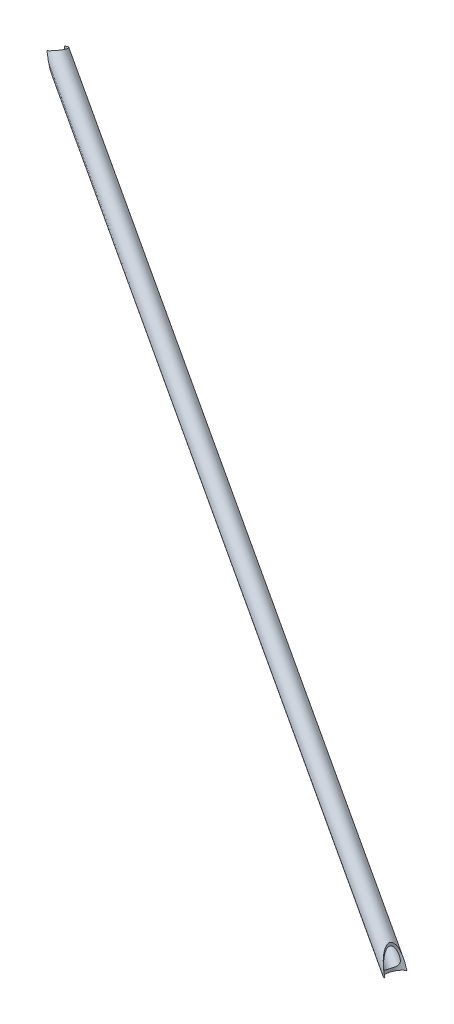
ISO-10303-21;
HEADER;
FILE_DESCRIPTION(('STEP AP214'),'2;1');
FILE_NAME('part.step','',(''),(''),'','','');
FILE_SCHEMA(('AUTOMOTIVE_DESIGN { 1 0 10303 214 1 1 1 1 }'));
ENDSEC;
DATA;
#1=APPLICATION_CONTEXT('core data for automotive mechanical design processes');
#2=APPLICATION_PROTOCOL_DEFINITION('international standard','automotive_design',2000,#1);
#3=PRODUCT_CONTEXT('',#1,'mechanical');
#4=PRODUCT('Part','Part','',(#3));
#5=PRODUCT_RELATED_PRODUCT_CATEGORY('part','',(#4));
#6=PRODUCT_DEFINITION_FORMATION('','',#4);
#7=PRODUCT_DEFINITION_CONTEXT('part definition',#1,'design');
#8=PRODUCT_DEFINITION('design','',#6,#7);
#9=PRODUCT_DEFINITION_SHAPE('','',#8);
#10=(LENGTH_UNIT() NAMED_UNIT(*) SI_UNIT(.MILLI.,.METRE.));
#11=(NAMED_UNIT(*) PLANE_ANGLE_UNIT() SI_UNIT($,.RADIAN.));
#12=(NAMED_UNIT(*) SI_UNIT($,.STERADIAN.) SOLID_ANGLE_UNIT());
#13=UNCERTAINTY_MEASURE_WITH_UNIT(LENGTH_MEASURE(1.E-05),#10,'distance_accuracy_value','');
#14=(GEOMETRIC_REPRESENTATION_CONTEXT(3) GLOBAL_UNCERTAINTY_ASSIGNED_CONTEXT((#13)) GLOBAL_UNIT_ASSIGNED_CONTEXT((#10,
#11,#12)) REPRESENTATION_CONTEXT('',''));
#15=CARTESIAN_POINT('',(0.,0.,0.));
#16=DIRECTION('',(0.,0.,1.));
#17=DIRECTION('',(1.,0.,0.));
#18=AXIS2_PLACEMENT_3D('',#15,#16,#17);
#19=CARTESIAN_POINT('',(316.,1090.7055236082,104.350647552722));
#20=DIRECTION('',(0.674536795202794,-0.713761614405262,0.188532410261841));
#21=DIRECTION('',(0.726795256763901,0.68685417283838,0.));
#22=AXIS2_PLACEMENT_3D('',#19,#20,#21);
#23=CYLINDRICAL_SURFACE('',#22,10.16);
#24=CARTESIAN_POINT('',(1003.83573895644,377.663699195391,294.536212095622));
#25=CARTESIAN_POINT('',(1003.77958325242,377.723122702227,294.661231030131));
#26=CARTESIAN_POINT('',(1003.72444653076,377.777357009715,294.789145948419));
#27=CARTESIAN_POINT('',(1003.6168165949,377.874139724159,295.050362144527));
#28=CARTESIAN_POINT('',(1003.5643219818,377.916694369361,295.183660503171));
#29=CARTESIAN_POINT('',(1003.46269674383,377.988851776964,295.454763437174));
#30=CARTESIAN_POINT('',(1003.41356156749,378.018472368345,295.592561526267));
#31=CARTESIAN_POINT('',(1003.3192442509,378.063867117744,295.8717605165));
#32=CARTESIAN_POINT('',(1003.27406193893,378.079641877529,296.013161260788));
#33=CARTESIAN_POINT('',(1003.18800522293,378.096822131917,296.298998535569));
#34=CARTESIAN_POINT('',(1003.14715611193,378.098147414102,296.443447556869));
#35=CARTESIAN_POINT('',(1003.07050491795,378.086170568695,296.733071130044));
#36=CARTESIAN_POINT('',(1003.03470288385,378.072868299447,296.878245688932));
#37=CARTESIAN_POINT('',(1002.96835669485,378.032108365034,297.167932953289));
#38=CARTESIAN_POINT('',(1002.93781744571,378.004637586781,297.312444920305));
#39=CARTESIAN_POINT('',(1002.88204210033,377.936455865253,297.599417322519));
#40=CARTESIAN_POINT('',(1002.85680931742,377.895736689947,297.741876424526));
#41=CARTESIAN_POINT('',(1002.80941119307,377.797973362509,298.036615434375));
#42=CARTESIAN_POINT('',(1002.78774332343,377.73977001905,298.18858947067));
#43=CARTESIAN_POINT('',(1002.75015190207,377.610769123733,298.48787161065));
#44=CARTESIAN_POINT('',(1002.73423225748,377.53996305426,298.635176478831));
#45=CARTESIAN_POINT('',(1002.69433456833,377.311165861743,299.069394572691));
#46=CARTESIAN_POINT('',(1002.67823338938,377.13683152107,299.348509452793));
#47=CARTESIAN_POINT('',(1002.66418729822,376.791035034544,299.836245990212));
#48=CARTESIAN_POINT('',(1002.66350633205,376.624654132522,300.048538103899));
#49=CARTESIAN_POINT('',(1002.6713270177,376.275491124984,300.45918967396));
#50=CARTESIAN_POINT('',(1002.67983495559,376.092697870363,300.657539493579));
#51=CARTESIAN_POINT('',(1002.70433406555,375.714239191725,301.041413536242));
#52=CARTESIAN_POINT('',(1002.72033482678,375.518557550008,301.226920973674));
#53=CARTESIAN_POINT('',(1002.75843093807,375.117098114253,301.586090695819));
#54=CARTESIAN_POINT('',(1002.78052868028,374.911316383546,301.759748297818));
#55=CARTESIAN_POINT('',(1002.83015265535,374.487760083389,302.099366939538));
#56=CARTESIAN_POINT('',(1002.85777273283,374.269833152424,302.265123144612));
#57=CARTESIAN_POINT('',(1002.91720306413,373.827168567866,302.58637204307));
#58=CARTESIAN_POINT('',(1002.94901281329,373.60243173703,302.741865969161));
#59=CARTESIAN_POINT('',(1003.01606794347,373.147045599506,303.043622775116));
#60=CARTESIAN_POINT('',(1003.05131664045,372.916390747523,303.189876516869));
#61=CARTESIAN_POINT('',(1003.12456256966,372.450222729757,303.473732522598));
#62=CARTESIAN_POINT('',(1003.16256012977,372.214708986818,303.611333750848));
#63=CARTESIAN_POINT('',(1003.2409459945,371.738187359821,303.879220425619));
#64=CARTESIAN_POINT('',(1003.28134647144,371.497156129566,304.009460697855));
#65=CARTESIAN_POINT('',(1003.36383179239,371.011391333141,304.262293331701));
#66=CARTESIAN_POINT('',(1003.40591677128,370.766657471476,304.384885078866));
#67=CARTESIAN_POINT('',(1003.53393663673,370.027849647861,304.741669492116));
#68=CARTESIAN_POINT('',(1003.62169301373,369.528832580256,304.965058755244));
#69=CARTESIAN_POINT('',(1003.7775674922,368.639936062762,305.335208805443));
#70=CARTESIAN_POINT('',(1003.84539626283,368.252303910451,305.487563738153));
#71=CARTESIAN_POINT('',(1003.98038449213,367.471296707215,305.777249793943));
#72=CARTESIAN_POINT('',(1004.04754389117,367.077921152302,305.914579589472));
#73=CARTESIAN_POINT('',(1004.17970838932,366.285212354389,306.174480170173));
#74=CARTESIAN_POINT('',(1004.2447096495,365.885870154068,306.29702557977));
#75=CARTESIAN_POINT('',(1004.37064585626,365.08215169156,306.526675208003));
#76=CARTESIAN_POINT('',(1004.43158108867,364.677775785586,306.633780512593));
#77=CARTESIAN_POINT('',(1004.54682882879,363.867349614769,306.830813464877));
#78=CARTESIAN_POINT('',(1004.60118985608,363.461337818766,306.920870139884));
#79=CARTESIAN_POINT('',(1004.70136064171,362.644576838814,307.083225195452));
#80=CARTESIAN_POINT('',(1004.74716830092,362.23382651815,307.155519218153));
#81=CARTESIAN_POINT('',(1004.82701927339,361.409197254041,307.279571258292));
#82=CARTESIAN_POINT('',(1004.86109438643,360.99532992446,307.33138484312));
#83=CARTESIAN_POINT('',(1004.91385638623,360.164421016721,307.410938132719));
#84=CARTESIAN_POINT('',(1004.9325543477,359.747381941732,307.438695163936));
#85=CARTESIAN_POINT('',(1004.94683854692,359.067740465826,307.459886171253));
#86=CARTESIAN_POINT('',(1004.9484432333,358.805541816427,307.462259656609));
#87=CARTESIAN_POINT('',(1004.94266687146,358.281396771201,307.453701177415));
#88=CARTESIAN_POINT('',(1004.93528549952,358.019450384803,307.442768733535));
#89=CARTESIAN_POINT('',(1004.91043061109,357.49748420461,307.405685910499));
#90=CARTESIAN_POINT('',(1004.89297315623,357.237462010144,307.379559750148));
#91=CARTESIAN_POINT('',(1004.84708407444,356.720657097351,307.310023223135));
#92=CARTESIAN_POINT('',(1004.81865260776,356.463874331778,307.266613108857));
#93=CARTESIAN_POINT('',(1004.74987033196,355.951915288149,307.159673250905));
#94=CARTESIAN_POINT('',(1004.70934387296,355.696823647782,307.095845941736));
#95=CARTESIAN_POINT('',(1004.61689381554,355.195133703879,306.946568478402));
#96=CARTESIAN_POINT('',(1004.56497103529,354.948534792086,306.861119876451));
#97=CARTESIAN_POINT('',(1004.4511047959,354.466859291696,306.667669050395));
#98=CARTESIAN_POINT('',(1004.38916565872,354.231777790183,306.559676547979));
#99=CARTESIAN_POINT('',(1004.25758672814,353.775654713854,306.321112477851));
#100=CARTESIAN_POINT('',(1004.18794759385,353.554611939879,306.190542842191));
#101=CARTESIAN_POINT('',(1004.05513683743,353.161380666346,305.92962492071));
#102=CARTESIAN_POINT('',(1003.99262463813,352.98691581898,305.802349432116));
#103=CARTESIAN_POINT('',(1003.86630420612,352.650072993936,305.533328026981));
#104=CARTESIAN_POINT('',(1003.80249612263,352.487693634533,305.391583769052));
#105=CARTESIAN_POINT('',(1003.67554101717,352.17519052131,305.094704300978));
#106=CARTESIAN_POINT('',(1003.61239449983,352.025075602456,304.939559600178));
#107=CARTESIAN_POINT('',(1003.48868519089,351.737196814553,304.617253018729));
#108=CARTESIAN_POINT('',(1003.42812258038,351.599433810479,304.450090297961));
#109=CARTESIAN_POINT('',(1003.30875995647,351.33038427307,304.097649566649));
#110=CARTESIAN_POINT('',(1003.25014757019,351.199630571065,303.911901760287));
#111=CARTESIAN_POINT('',(1003.13923764174,350.950957429932,303.530228994893));
#112=CARTESIAN_POINT('',(1003.08694012546,350.833038043417,303.334303994145));
#113=CARTESIAN_POINT('',(1002.99006508965,350.609605057875,302.933649535248));
#114=CARTESIAN_POINT('',(1002.94548837373,350.504092750592,302.728919163366));
#115=CARTESIAN_POINT('',(1002.86523906876,350.305083606422,302.312003659968));
#116=CARTESIAN_POINT('',(1002.82956718113,350.211587716344,302.099817942697));
#117=CARTESIAN_POINT('',(1002.76339038914,350.022801858431,301.636238286715));
#118=CARTESIAN_POINT('',(1002.73451786881,349.92943737347,301.383823436134));
#119=CARTESIAN_POINT('',(1002.69111533001,349.757769412723,300.872706891547));
#120=CARTESIAN_POINT('',(1002.67658654326,349.67946723084,300.61400465958));
#121=CARTESIAN_POINT('',(1002.66276241718,349.537550878494,300.092101680528));
#122=CARTESIAN_POINT('',(1002.66347245301,349.473941898736,299.828899378851));
#123=CARTESIAN_POINT('',(1002.68075957639,349.361187449783,299.29993249857));
#124=CARTESIAN_POINT('',(1002.69733678954,349.312042095068,299.034167899704));
#125=CARTESIAN_POINT('',(1002.74804219561,349.225790110027,298.487686708289));
#126=CARTESIAN_POINT('',(1002.78305905271,349.189465078802,298.206928429204));
#127=CARTESIAN_POINT('',(1002.87123562461,349.132521635638,297.6466621541));
#128=CARTESIAN_POINT('',(1002.9243960906,349.111903874131,297.367154210333));
#129=CARTESIAN_POINT('',(1003.04869281667,349.086304121698,296.811437113851));
#130=CARTESIAN_POINT('',(1003.11982908017,349.08132213375,296.535227961765));
#131=CARTESIAN_POINT('',(1003.27962124848,349.086977200865,295.988091188788));
#132=CARTESIAN_POINT('',(1003.36827697428,349.097614096341,295.717163513962));
#133=CARTESIAN_POINT('',(1003.5624140283,349.134551325821,295.182361421104));
#134=CARTESIAN_POINT('',(1003.66790291229,349.16085870827,294.918490232857));
#135=CARTESIAN_POINT('',(1003.89466021804,349.229237471414,294.399722499034));
#136=CARTESIAN_POINT('',(1004.01592871426,349.271308926499,294.144825995817));
#137=CARTESIAN_POINT('',(1004.27295949532,349.371383518838,293.64566632928));
#138=CARTESIAN_POINT('',(1004.40872286518,349.429387849273,293.401403963918));
#139=CARTESIAN_POINT('',(1004.69315974149,349.56157658286,292.925077109294));
#140=CARTESIAN_POINT('',(1004.84183328391,349.635761031107,292.69301265403));
#141=CARTESIAN_POINT('',(1005.15050804831,349.800818522725,292.242065832542));
#142=CARTESIAN_POINT('',(1005.31052995276,349.891722544214,292.023208953894));
#143=CARTESIAN_POINT('',(1005.63945048297,350.090606107592,291.600418543504));
#144=CARTESIAN_POINT('',(1005.80834923756,350.198585897352,291.396485228453));
#145=CARTESIAN_POINT('',(1006.15254775496,350.432294756946,291.004558817555));
#146=CARTESIAN_POINT('',(1006.32785125005,350.558034302406,290.816575235202));
#147=CARTESIAN_POINT('',(1006.68175118686,350.827928176967,290.457675102995));
#148=CARTESIAN_POINT('',(1006.86034755612,350.97208210134,290.286758178181));
#149=CARTESIAN_POINT('',(1007.21362839989,351.276376868525,289.966176552485));
#150=CARTESIAN_POINT('',(1007.38831741338,351.43612557877,289.816145531859));
#151=CARTESIAN_POINT('',(1007.73368348626,351.774617578692,289.533865451941));
#152=CARTESIAN_POINT('',(1007.90436055483,351.953360824879,289.401616351937));
#153=CARTESIAN_POINT('',(1008.23704306747,352.329671279825,289.155580167698));
#154=CARTESIAN_POINT('',(1008.39906794207,352.5271932782,289.041750439902));
#155=CARTESIAN_POINT('',(1008.71035285124,352.941031171675,288.832256905756));
#156=CARTESIAN_POINT('',(1008.85961596965,353.15734250077,288.736588703868));
#157=CARTESIAN_POINT('',(1009.12188025134,353.576730806513,288.57484703287));
#158=CARTESIAN_POINT('',(1009.23705033901,353.777586721239,288.506516610709));
#159=CARTESIAN_POINT('',(1009.4523861614,354.190882464492,288.382494674762));
#160=CARTESIAN_POINT('',(1009.55255399285,354.403320668593,288.326801394231));
#161=CARTESIAN_POINT('',(1009.73635131991,354.837920149904,288.227154763293));
#162=CARTESIAN_POINT('',(1009.81997721049,355.060083533683,288.183203971215));
#163=CARTESIAN_POINT('',(1009.97002156448,355.511933720075,288.105938386587));
#164=CARTESIAN_POINT('',(1010.03643744168,355.741621647586,288.072625192403));
#165=CARTESIAN_POINT('',(1010.16430053477,356.254689455337,288.009462766995));
#166=CARTESIAN_POINT('',(1010.22184539845,356.539305877693,287.981772886421));
#167=CARTESIAN_POINT('',(1010.31379335929,357.113094886914,287.938000343505));
#168=CARTESIAN_POINT('',(1010.34818963941,357.402268790279,287.921921100291));
#169=CARTESIAN_POINT('',(1010.39637282279,357.98318556023,287.899492800514));
#170=CARTESIAN_POINT('',(1010.41011978055,358.274932310661,287.893162602595));
#171=CARTESIAN_POINT('',(1010.41960586037,358.858844119905,287.888788947392));
#172=CARTESIAN_POINT('',(1010.41533682703,359.151009308301,287.890749243017));
#173=CARTESIAN_POINT('',(1010.39197197192,359.719774677685,287.90155433891));
#174=CARTESIAN_POINT('',(1010.37363612791,359.996415488389,287.910046315626));
#175=CARTESIAN_POINT('',(1010.32502258793,360.548335284921,287.932789422111));
#176=CARTESIAN_POINT('',(1010.29474683512,360.823614484967,287.947039614769));
#177=CARTESIAN_POINT('',(1010.22390596152,361.372773770199,287.980827816863));
#178=CARTESIAN_POINT('',(1010.18333075347,361.646652213662,288.000371011525));
#179=CARTESIAN_POINT('',(1010.09332574543,362.192544169734,288.044418341151));
#180=CARTESIAN_POINT('',(1010.04389562052,362.46455761353,288.068922658162));
#181=CARTESIAN_POINT('',(1009.93707406875,363.008071811455,288.122847451982));
#182=CARTESIAN_POINT('',(1009.87964067895,363.279561672245,288.152294020346));
#183=CARTESIAN_POINT('',(1009.75801586215,363.820451311399,288.215918823223));
#184=CARTESIAN_POINT('',(1009.69382457482,364.089851132833,288.250096959954));
#185=CARTESIAN_POINT('',(1009.55954093231,364.626376745791,288.323161714441));
#186=CARTESIAN_POINT('',(1009.48945167813,364.893503652,288.362045862561));
#187=CARTESIAN_POINT('',(1009.34402083757,365.425581213033,288.444604788808));
#188=CARTESIAN_POINT('',(1009.26867908393,365.690531798255,288.488279719521));
#189=CARTESIAN_POINT('',(1009.07669555609,366.342565650633,288.602291595871));
#190=CARTESIAN_POINT('',(1008.95732594475,366.72835106001,288.675492295108));
#191=CARTESIAN_POINT('',(1008.70989707385,367.494819871508,288.833167059609));
#192=CARTESIAN_POINT('',(1008.58183719615,367.875502908388,288.917641927216));
#193=CARTESIAN_POINT('',(1008.31796109581,368.631839788787,289.09889136588));
#194=CARTESIAN_POINT('',(1008.18213441427,369.007485967843,289.195682748073));
#195=CARTESIAN_POINT('',(1007.90377533669,369.752537539499,289.402667045679));
#196=CARTESIAN_POINT('',(1007.76124335879,370.12194331929,289.512859126132));
#197=CARTESIAN_POINT('',(1007.47116185768,370.851108106527,289.747404459089));
#198=CARTESIAN_POINT('',(1007.3236527817,371.21091545542,289.871656912164));
#199=CARTESIAN_POINT('',(1007.02327657142,371.922172561507,290.136894997204));
#200=CARTESIAN_POINT('',(1006.87040834185,372.273620585374,290.277884063865));
#201=CARTESIAN_POINT('',(1006.5602736248,372.965279490447,290.578727314543));
#202=CARTESIAN_POINT('',(1006.40301815634,373.305514535665,290.738537002143));
#203=CARTESIAN_POINT('',(1006.08446740154,373.972536820661,291.080410221425));
#204=CARTESIAN_POINT('',(1005.92317460442,374.299332033518,291.262460296995));
#205=CARTESIAN_POINT('',(1005.65821459607,374.816387015574,291.580082435444));
#206=CARTESIAN_POINT('',(1005.55551386225,375.012073056912,291.707633412397));
#207=CARTESIAN_POINT('',(1005.34914199559,375.394909092301,291.974420773285));
#208=CARTESIAN_POINT('',(1005.24547067792,375.582057418742,292.113659425134));
#209=CARTESIAN_POINT('',(1005.03791028391,375.945199722312,292.40482392612));
#210=CARTESIAN_POINT('',(1004.93402249189,376.121221667886,292.556715541146));
#211=CARTESIAN_POINT('',(1004.72649647634,376.459741673584,292.874945936805));
#212=CARTESIAN_POINT('',(1004.62285814612,376.622247202989,293.041276633019));
#213=CARTESIAN_POINT('',(1004.40263007628,376.951283435097,293.413927436167));
#214=CARTESIAN_POINT('',(1004.28621587765,377.115303215756,293.622602521471));
#215=CARTESIAN_POINT('',(1004.05717147108,377.413948560872,294.062626764866));
#216=CARTESIAN_POINT('',(1003.94454256376,377.548564107753,294.293983611518));
#217=CARTESIAN_POINT('',(1003.83573895644,377.663699195391,294.536212095622));
#218=B_SPLINE_CURVE_WITH_KNOTS('',3,(#24,#25,#26,#27,#28,#29,#30,#31,#32,#33,#34,#35,#36,#37,
#38,#39,#40,#41,#42,#43,#44,#45,#46,#47,#48,#49,#50,#51,#52,#53,#54,#55,#56,#57,#58,#59,#60,#61,
#62,#63,#64,#65,#66,#67,#68,#69,#70,#71,#72,#73,#74,#75,#76,#77,#78,#79,#80,#81,#82,#83,#84,#85,
#86,#87,#88,#89,#90,#91,#92,#93,#94,#95,#96,#97,#98,#99,#100,#101,#102,#103,#104,#105,#106,#107,
#108,#109,#110,#111,#112,#113,#114,#115,#116,#117,#118,#119,#120,#121,#122,#123,#124,#125,#126,
#127,#128,#129,#130,#131,#132,#133,#134,#135,#136,#137,#138,#139,#140,#141,#142,#143,#144,#145,
#146,#147,#148,#149,#150,#151,#152,#153,#154,#155,#156,#157,#158,#159,#160,#161,#162,#163,#164,
#165,#166,#167,#168,#169,#170,#171,#172,#173,#174,#175,#176,#177,#178,#179,#180,#181,#182,#183,
#184,#185,#186,#187,#188,#189,#190,#191,#192,#193,#194,#195,#196,#197,#198,#199,#200,#201,#202,
#203,#204,#205,#206,#207,#208,#209,#210,#211,#212,#213,#214,#215,#216,#217),.UNSPECIFIED.,.T.,
.F.,(4,2,2,2,2,2,2,2,2,2,2,2,2,2,2,2,2,2,2,2,2,2,2,2,2,2,2,2,2,2,2,2,2,2,2,2,2,2,2,2,2,2,2,2,2,
2,2,2,2,2,2,2,2,2,2,2,2,2,2,2,2,2,2,2,2,2,2,2,2,2,2,2,2,2,2,2,2,2,2,2,2,2,2,2,2,2,2,2,2,2,2,2,2,
2,2,2,4),(0.,0.447951542193327,0.895663360473718,1.34275606585846,1.78982933880901,
2.239383164358,2.6889413435254,3.13891634157766,3.58917147197105,4.08094909714516,
4.57306036358255,5.55760600873158,6.36576063267842,7.17446846030288,7.98421409483012,
8.7942778863335,9.61950029251625,10.4446233916468,11.2705501224898,12.0965755314016,
12.9272164901665,13.7579240929256,15.4181722554552,16.6838546008606,17.9496486859686,
19.2175853405132,20.485432773309,21.7432635346628,23.0014025827728,24.2561042318026,
25.5099014441918,26.2961411445024,27.082409168964,27.8674273030292,28.6524339744384,
29.4494469467049,30.2464027168812,31.0430155202381,31.8395601866834,32.5132320931935,
33.1868268606463,33.860902665526,34.5350256374895,35.238121889262,35.94122102314,
36.6443932943825,37.3476209367549,38.1587391343938,38.9699269787285,39.781400956745,
40.5928813575042,41.4476286240082,42.3024112832941,43.1571941053964,44.0119681938316,
44.8671270427262,45.722289927204,46.5775168705712,47.4327461975512,48.2895763595107,
49.1464189603073,50.0037690986154,50.8611003964826,51.7007070094966,52.5403117002166,
53.3779438766233,54.2153730660924,54.9385446493673,55.6616150667651,56.3848428909196,
57.1081793335225,57.9818688560607,58.8558155598879,59.7314507203243,60.6074823024441,
61.4392548923716,62.2708921713238,63.103347119302,63.9358326192574,64.7728598790247,
65.6098698436087,66.4464424485002,67.2830417056763,68.5139773185352,69.7450005796699,
70.9777224917313,72.2103676356075,73.4346773895599,74.6592388325998,75.8809611446884,
77.1019479047373,77.8671113143929,78.6324235435086,79.3957284947877,80.1586087957248,
81.0262351828326,81.8941566976304),.UNSPECIFIED.);
#219=CARTESIAN_POINT('',(1003.83573895644,377.663699195391,294.536212095622));
#220=VERTEX_POINT('',#219);
#221=EDGE_CURVE('E84',#220,#220,#218,.T.);
#222=ORIENTED_EDGE('',*,*,#221,.T.);
#223=EDGE_LOOP('',(#222));
#224=FACE_BOUND('',#223,.T.);
#225=CARTESIAN_POINT('',(328.789543947671,1089.72851031678,100.704384309483));
#226=CARTESIAN_POINT('',(328.752269274653,1089.66335629761,100.591093395466));
#227=CARTESIAN_POINT('',(328.713258675147,1089.5966804052,100.47926661526));
#228=CARTESIAN_POINT('',(328.631922594443,1089.46027237912,100.258723862126));
#229=CARTESIAN_POINT('',(328.58959707035,1089.39054020591,100.150007929478));
#230=CARTESIAN_POINT('',(328.45788443066,1089.1767420376,99.828802952248));
#231=CARTESIAN_POINT('',(328.363761813844,1089.02807537489,99.6212584403727));
#232=CARTESIAN_POINT('',(328.163981276908,1088.71759522495,99.2199714460212));
#233=CARTESIAN_POINT('',(328.058259589122,1088.55571045536,99.0263160424245));
#234=CARTESIAN_POINT('',(327.837736686483,1088.21937592284,98.6558102336055));
#235=CARTESIAN_POINT('',(327.722936065334,1088.04492698158,98.4789587311767));
#236=CARTESIAN_POINT('',(327.486310921113,1087.68268732334,98.1432483775281));
#237=CARTESIAN_POINT('',(327.364466570441,1087.49485856034,97.9844444621928));
#238=CARTESIAN_POINT('',(327.116946467225,1087.1060732983,97.6871170604472));
#239=CARTESIAN_POINT('',(326.991270577233,1086.90511632801,97.548594302623));
#240=CARTESIAN_POINT('',(326.739877679184,1086.49066439118,97.2938602732204));
#241=CARTESIAN_POINT('',(326.614162174722,1086.2772129772,97.1775768996117));
#242=CARTESIAN_POINT('',(326.366053617468,1085.83741234483,96.9681346335656));
#243=CARTESIAN_POINT('',(326.243660045754,1085.61106515822,96.8749721106595));
#244=CARTESIAN_POINT('',(326.016187835341,1085.16582387988,96.7195083719972));
#245=CARTESIAN_POINT('',(325.910519136725,1084.94790817563,96.6552685205722));
#246=CARTESIAN_POINT('',(325.708279550511,1084.50301070636,96.5471105790857));
#247=CARTESIAN_POINT('',(325.611707587964,1084.27603001707,96.5031900855095));
#248=CARTESIAN_POINT('',(325.430200021671,1083.81459097944,96.4352098656575));
#249=CARTESIAN_POINT('',(325.345263560396,1083.58013318373,96.4111486751061));
#250=CARTESIAN_POINT('',(325.188812214143,1083.10564035162,96.3817510917716));
#251=CARTESIAN_POINT('',(325.117298610592,1082.86560478518,96.376416485881));
#252=CARTESIAN_POINT('',(324.982495059465,1082.35903752229,96.3831101196296));
#253=CARTESIAN_POINT('',(324.920628031749,1082.09215174475,96.3968328236828));
#254=CARTESIAN_POINT('',(324.814047351246,1081.55651705712,96.4421167126289));
#255=CARTESIAN_POINT('',(324.769336455942,1081.28776785458,96.4736807631233));
#256=CARTESIAN_POINT('',(324.696037008026,1080.74993452308,96.5520374381106));
#257=CARTESIAN_POINT('',(324.66747333215,1080.48085051396,96.5988533860459));
#258=CARTESIAN_POINT('',(324.625033066569,1079.94399696662,96.7052839420785));
#259=CARTESIAN_POINT('',(324.611162956302,1079.67622806008,96.7649041825713));
#260=CARTESIAN_POINT('',(324.597214631605,1079.17265108245,96.887644787647));
#261=CARTESIAN_POINT('',(324.595774458178,1078.9365995578,96.949639004993));
#262=CARTESIAN_POINT('',(324.601931212564,1078.46672091085,97.0809203176196));
#263=CARTESIAN_POINT('',(324.609526435135,1078.23289337721,97.1502060345337));
#264=CARTESIAN_POINT('',(324.632633980445,1077.76743212985,97.2951986974552));
#265=CARTESIAN_POINT('',(324.648153048627,1077.53580045682,97.3709110685105));
#266=CARTESIAN_POINT('',(324.686102723852,1077.07501795707,97.5279786174441));
#267=CARTESIAN_POINT('',(324.708534208631,1076.84586744923,97.6093345109187));
#268=CARTESIAN_POINT('',(324.785098030104,1076.15973738579,97.8618833320162));
#269=CARTESIAN_POINT('',(324.848355552405,1075.70658501037,98.0407640671264));
#270=CARTESIAN_POINT('',(324.99311765738,1074.81079353077,98.4156781771252));
#271=CARTESIAN_POINT('',(325.074614673947,1074.36815015121,98.6117044192313));
#272=CARTESIAN_POINT('',(325.251349521591,1073.49372648996,99.0190567363568));
#273=CARTESIAN_POINT('',(325.346564080098,1073.0619292357,99.2303566022358));
#274=CARTESIAN_POINT('',(325.547549643091,1072.20842248166,99.6679140991412));
#275=CARTESIAN_POINT('',(325.653322459886,1071.78671472919,99.8941742958286));
#276=CARTESIAN_POINT('',(325.873049728211,1070.95307018331,100.362052453641));
#277=CARTESIAN_POINT('',(325.987018182087,1070.54115179268,100.603696613624));
#278=CARTESIAN_POINT('',(326.220892583496,1069.72861929324,101.102530522233));
#279=CARTESIAN_POINT('',(326.340797927077,1069.32800404107,101.359718690177));
#280=CARTESIAN_POINT('',(326.58412966157,1068.54141468692,101.889287277301));
#281=CARTESIAN_POINT('',(326.707533088475,1068.15537223835,102.161576466741));
#282=CARTESIAN_POINT('',(326.956921132132,1067.39740460078,102.72427325096));
#283=CARTESIAN_POINT('',(327.08290633911,1067.02548269662,103.014685020536));
#284=CARTESIAN_POINT('',(327.335511378452,1066.29952425798,103.615033706802));
#285=CARTESIAN_POINT('',(327.462128753714,1065.94544428944,103.924918624193));
#286=CARTESIAN_POINT('',(327.651318918931,1065.43036308253,104.40695178111));
#287=CARTESIAN_POINT('',(327.714246166124,1065.26137718672,104.570460014354));
#288=CARTESIAN_POINT('',(327.839585617485,1064.92947272324,104.903700244952));
#289=CARTESIAN_POINT('',(327.901997867737,1064.76655360801,105.073431677867));
#290=CARTESIAN_POINT('',(328.038510513697,1064.41547982317,105.454598723315));
#291=CARTESIAN_POINT('',(328.112426211604,1064.22887242388,105.667534777809));
#292=CARTESIAN_POINT('',(328.258372930053,1063.86775678678,106.104208843176));
#293=CARTESIAN_POINT('',(328.330403429313,1063.69325187392,106.327949794085));
#294=CARTESIAN_POINT('',(328.47143873118,1063.35969050414,106.786643205175));
#295=CARTESIAN_POINT('',(328.540451508897,1063.20059178495,107.021562195982));
#296=CARTESIAN_POINT('',(328.674373243188,1062.90123709436,107.504112252246));
#297=CARTESIAN_POINT('',(328.739284927988,1062.76096852497,107.751734663834));
#298=CARTESIAN_POINT('',(328.870349103489,1062.48989143206,108.289439103998));
#299=CARTESIAN_POINT('',(328.935815733568,1062.36193444264,108.581159971784));
#300=CARTESIAN_POINT('',(329.056203522552,1062.14573306696,109.181296488541));
#301=CARTESIAN_POINT('',(329.111133675244,1062.05745472434,109.48969760858));
#302=CARTESIAN_POINT('',(329.196867936923,1061.94523007369,110.059997040325));
#303=CARTESIAN_POINT('',(329.230271479967,1061.91226196851,110.319630652186));
#304=CARTESIAN_POINT('',(329.270792841642,1061.8939502596,110.711340336065));
#305=CARTESIAN_POINT('',(329.282701960762,1061.89303504048,110.84227423546));
#306=CARTESIAN_POINT('',(329.303033098404,1061.90222115967,111.104003121607));
#307=CARTESIAN_POINT('',(329.311456728209,1061.91231739969,111.234798144605));
#308=CARTESIAN_POINT('',(329.32462681396,1061.94407999161,111.49618448104));
#309=CARTESIAN_POINT('',(329.329344830406,1061.96583371249,111.626766687861));
#310=CARTESIAN_POINT('',(329.334855894999,1062.02105806841,111.885518574016));
#311=CARTESIAN_POINT('',(329.335648952429,1062.05452867574,112.013688259056));
#312=CARTESIAN_POINT('',(329.333293762785,1062.13291775544,112.266476866527));
#313=CARTESIAN_POINT('',(329.330144553545,1062.17783902039,112.391094914535));
#314=CARTESIAN_POINT('',(329.320026399686,1062.27845601085,112.63569779271));
#315=CARTESIAN_POINT('',(329.313057528767,1062.33415152846,112.755682712223));
#316=CARTESIAN_POINT('',(329.288564188236,1062.50348433861,113.083101082094));
#317=CARTESIAN_POINT('',(329.267050462543,1062.62811030579,113.284648824267));
#318=CARTESIAN_POINT('',(329.214315206706,1062.90277357714,113.667803068179));
#319=CARTESIAN_POINT('',(329.183090183476,1063.05282001604,113.849402362746));
#320=CARTESIAN_POINT('',(329.088709224697,1063.48269182099,114.311552728291));
#321=CARTESIAN_POINT('',(329.018390687551,1063.78060334389,114.573873637727));
#322=CARTESIAN_POINT('',(328.902517349437,1064.25215132388,114.930171225467));
#323=CARTESIAN_POINT('',(328.862070183907,1064.41379085741,115.04292526421));
#324=CARTESIAN_POINT('',(328.778381299378,1064.74366128124,115.257233656125));
#325=CARTESIAN_POINT('',(328.735140156835,1064.91189080909,115.358790307925));
#326=CARTESIAN_POINT('',(328.607386070386,1065.40404058001,115.636892442234));
#327=CARTESIAN_POINT('',(328.520094997964,1065.7344695759,115.800618526758));
#328=CARTESIAN_POINT('',(328.340633440408,1066.40709379728,116.098740089822));
#329=CARTESIAN_POINT('',(328.248458447101,1066.74929978787,116.23310786138));
#330=CARTESIAN_POINT('',(328.060923065353,1067.44247256917,116.477626499503));
#331=CARTESIAN_POINT('',(327.96555436552,1067.79346150177,116.587707428226));
#332=CARTESIAN_POINT('',(327.773305357996,1068.50071835329,116.786883900079));
#333=CARTESIAN_POINT('',(327.676425558626,1068.85698449507,116.875986344492));
#334=CARTESIAN_POINT('',(327.472325997209,1069.60972656981,117.044229784898));
#335=CARTESIAN_POINT('',(327.365054221382,1070.00661547638,117.121443505833));
#336=CARTESIAN_POINT('',(327.151063522365,1070.80383133153,117.25680293267));
#337=CARTESIAN_POINT('',(327.044344731235,1071.20415904571,117.314944273322));
#338=CARTESIAN_POINT('',(326.83239666635,1072.0077676483,117.414303729809));
#339=CARTESIAN_POINT('',(326.727169208716,1072.41105135871,117.4555026807));
#340=CARTESIAN_POINT('',(326.519345275263,1073.21952331785,117.522439320117));
#341=CARTESIAN_POINT('',(326.416748581327,1073.62471140537,117.548178294415));
#342=CARTESIAN_POINT('',(326.215359985708,1074.43614995432,117.585286361531));
#343=CARTESIAN_POINT('',(326.116563558049,1074.84239849528,117.596673095594));
#344=CARTESIAN_POINT('',(325.9238153771,1075.65621892668,117.605858308928));
#345=CARTESIAN_POINT('',(325.829863888954,1076.06379088826,117.603656045323));
#346=CARTESIAN_POINT('',(325.648271861127,1076.87968499947,117.586038348682));
#347=CARTESIAN_POINT('',(325.560625895269,1077.28800618634,117.570634427312));
#348=CARTESIAN_POINT('',(325.3932351835,1078.10552033101,117.526642150995));
#349=CARTESIAN_POINT('',(325.313489430323,1078.51471317087,117.498055479465));
#350=CARTESIAN_POINT('',(325.173214413572,1079.28317452592,117.431672284775));
#351=CARTESIAN_POINT('',(325.111528224401,1079.64236666023,117.395449483102));
#352=CARTESIAN_POINT('',(324.997585493697,1080.36098789364,117.312000172295));
#353=CARTESIAN_POINT('',(324.945328784006,1080.72041698839,117.264773859425));
#354=CARTESIAN_POINT('',(324.852338379079,1081.43971223518,117.15830207341));
#355=CARTESIAN_POINT('',(324.811626102615,1081.79957797153,117.099034604955));
#356=CARTESIAN_POINT('',(324.744573545602,1082.51827348871,116.967165550808));
#357=CARTESIAN_POINT('',(324.71823363628,1082.87710324254,116.894563620761));
#358=CARTESIAN_POINT('',(324.682942986,1083.59853974707,116.732715779582));
#359=CARTESIAN_POINT('',(324.674303324123,1083.96110332437,116.64320183326));
#360=CARTESIAN_POINT('',(324.679452474823,1084.68124561846,116.445678592521));
#361=CARTESIAN_POINT('',(324.693246175125,1085.0388232318,116.337665272095));
#362=CARTESIAN_POINT('',(324.747501647624,1085.74287450987,116.10046869262));
#363=CARTESIAN_POINT('',(324.787820516133,1086.08939730108,115.971401646732));
#364=CARTESIAN_POINT('',(324.898699137755,1086.7669535558,115.688157367783));
#365=CARTESIAN_POINT('',(324.969226287107,1087.09800329333,115.53400731769));
#366=CARTESIAN_POINT('',(325.10811811914,1087.61208520841,115.263216755656));
#367=CARTESIAN_POINT('',(325.166599193915,1087.80249200613,115.155393418498));
#368=CARTESIAN_POINT('',(325.294875068028,1088.17271213553,114.928818610224));
#369=CARTESIAN_POINT('',(325.36466806264,1088.35252715082,114.81006888363));
#370=CARTESIAN_POINT('',(325.514607389603,1088.69975150234,114.561457000553));
#371=CARTESIAN_POINT('',(325.594754223036,1088.86716023755,114.431594306353));
#372=CARTESIAN_POINT('',(325.76384800698,1089.18807727863,114.160870664389));
#373=CARTESIAN_POINT('',(325.85279533781,1089.3415849832,114.020009241363));
#374=CARTESIAN_POINT('',(326.037361032915,1089.63342573257,113.727896781127));
#375=CARTESIAN_POINT('',(326.132968970268,1089.7717816607,113.57666198851));
#376=CARTESIAN_POINT('',(326.328770517144,1090.03305340096,113.264174764713));
#377=CARTESIAN_POINT('',(326.428964226071,1090.15596887816,113.102922116355));
#378=CARTESIAN_POINT('',(326.631791244819,1090.3863763652,112.770913058711));
#379=CARTESIAN_POINT('',(326.734426955619,1090.49385239717,112.60014705427));
#380=CARTESIAN_POINT('',(326.939886780072,1090.69346620516,112.250001417677));
#381=CARTESIAN_POINT('',(327.042710897689,1090.78560365453,112.07062160219));
#382=CARTESIAN_POINT('',(327.250994610384,1090.95865509325,111.696067107758));
#383=CARTESIAN_POINT('',(327.356375570084,1091.03891045834,111.500544829998));
#384=CARTESIAN_POINT('',(327.563225021175,1091.18385274696,111.101807862354));
#385=CARTESIAN_POINT('',(327.664693174986,1091.24853832971,110.898592511729));
#386=CARTESIAN_POINT('',(327.861943908863,1091.36298858002,110.485449295981));
#387=CARTESIAN_POINT('',(327.957729175999,1091.41276034518,110.275524676665));
#388=CARTESIAN_POINT('',(328.142166875485,1091.49808299607,109.849814914287));
#389=CARTESIAN_POINT('',(328.230820886957,1091.53363703709,109.634031082903));
#390=CARTESIAN_POINT('',(328.410964857021,1091.59498363962,109.168489349366));
#391=CARTESIAN_POINT('',(328.501275998002,1091.61886032913,108.918016158618));
#392=CARTESIAN_POINT('',(328.627454317384,1091.642226934,108.538785508564));
#393=CARTESIAN_POINT('',(328.667935904368,1091.6479414704,108.41189536283));
#394=CARTESIAN_POINT('',(328.745689170339,1091.65533573726,108.157024161408));
#395=CARTESIAN_POINT('',(328.782960975783,1091.65701562675,108.029043148916));
#396=CARTESIAN_POINT('',(328.818555891287,1091.65672672962,107.900585930182));
#397=B_SPLINE_CURVE_WITH_KNOTS('',3,(#225,#226,#227,#228,#229,#230,#231,#232,#233,#234,#235,
#236,#237,#238,#239,#240,#241,#242,#243,#244,#245,#246,#247,#248,#249,#250,#251,#252,#253,#254,
#255,#256,#257,#258,#259,#260,#261,#262,#263,#264,#265,#266,#267,#268,#269,#270,#271,#272,#273,
#274,#275,#276,#277,#278,#279,#280,#281,#282,#283,#284,#285,#286,#287,#288,#289,#290,#291,#292,
#293,#294,#295,#296,#297,#298,#299,#300,#301,#302,#303,#304,#305,#306,#307,#308,#309,#310,#311,
#312,#313,#314,#315,#316,#317,#318,#319,#320,#321,#322,#323,#324,#325,#326,#327,#328,#329,#330,
#331,#332,#333,#334,#335,#336,#337,#338,#339,#340,#341,#342,#343,#344,#345,#346,#347,#348,#349,
#350,#351,#352,#353,#354,#355,#356,#357,#358,#359,#360,#361,#362,#363,#364,#365,#366,#367,#368,
#369,#370,#371,#372,#373,#374,#375,#376,#377,#378,#379,#380,#381,#382,#383,#384,#385,#386,#387,
#388,#389,#390,#391,#392,#393,#394,#395,#396),.UNSPECIFIED.,.F.,.F.,(4,2,2,2,2,2,2,2,2,2,2,2,2,
2,2,2,2,2,2,2,2,2,2,2,2,2,2,2,2,2,2,2,2,2,2,2,2,2,2,2,2,2,2,2,2,2,2,2,2,2,2,2,2,2,2,2,2,2,2,2,2,
2,2,2,2,2,2,2,2,2,2,2,2,2,2,2,2,2,2,2,2,2,2,2,2,4),(0.,0.407647838728789,0.8153009533408,
1.63061332278091,2.4506567829709,3.27064666178499,4.09306922875523,4.91552133342431,
5.73526001346913,6.55486989542286,7.30543607897772,8.05591345764035,8.80633549679802,
9.55682913934602,10.378490995626,11.2002848612615,12.0233413727485,12.8467606773988,
13.5786303515682,14.3103619226204,15.0427174462028,15.7751660024867,17.2479421184738,
18.7201084259647,20.1898059077431,21.6597560961678,23.1322802810458,24.6046549750502,
26.0689403988016,27.5335643959739,28.9944311716797,29.7245497128002,30.4546021957558,
31.3320731108704,32.2097841481401,33.0850148590786,33.9596570610397,34.9329522233311,
35.9054128613085,36.6935615290844,37.0875610484468,37.4813782243866,37.8781890764887,
38.2749989902256,38.6719057700696,39.0688048920276,39.7795938724631,40.4906388150278,
41.6925272183959,42.2958566788016,42.8990620546773,44.0340407502275,45.1700860019891,
46.3093611729387,47.448261031747,48.7026874403003,49.9574007595321,51.2135295108159,
52.469553778113,53.7240326761825,54.9785801540106,56.2320347952718,57.4853294167448,
58.5838195264464,59.6822900444978,60.7827854524955,61.8833092841147,63.0030142651939,
64.1229632374093,65.236927386601,66.3496922532844,67.0284832333235,67.7071660240856,
68.3858816724897,69.0646266649259,69.7423320020493,70.4200520362569,71.0984684487776,
71.7768993071299,72.4847027195046,73.192567062096,73.9000939891143,74.6074638098094,
75.4084967103976,75.8083492933269,76.2081861161375),.UNSPECIFIED.);
#398=CARTESIAN_POINT('',(328.789543947671,1089.72851031678,100.704384309483));
#399=VERTEX_POINT('',#398);
#400=CARTESIAN_POINT('',(328.818555891287,1091.65672672962,107.900585930182));
#401=VERTEX_POINT('',#400);
#402=EDGE_CURVE('E73',#399,#401,#397,.T.);
#403=ORIENTED_EDGE('',*,*,#402,.T.);
#404=CARTESIAN_POINT('',(324.707522341061,1087.25397164176,115.50866086056));
#405=CARTESIAN_POINT('',(324.779882478532,1087.46432070714,115.404022509531));
#406=CARTESIAN_POINT('',(324.858179948624,1087.66951578817,115.292988723518));
#407=CARTESIAN_POINT('',(325.025503583271,1088.06775426785,115.057915465855));
#408=CARTESIAN_POINT('',(325.114531298665,1088.26079590382,114.933874114563));
#409=CARTESIAN_POINT('',(325.301704180286,1088.63194208075,114.673218917329));
#410=CARTESIAN_POINT('',(325.399804234677,1088.81011294802,114.53666730684));
#411=CARTESIAN_POINT('',(325.603650322833,1089.15104387268,114.250707114572));
#412=CARTESIAN_POINT('',(325.709395254868,1089.31380614288,114.101300384799));
#413=CARTESIAN_POINT('',(325.926588667208,1089.62318015974,113.789798794146));
#414=CARTESIAN_POINT('',(326.038046298259,1089.76976472832,113.62768334133));
#415=CARTESIAN_POINT('',(326.264171530079,1090.04593432102,113.291631748373));
#416=CARTESIAN_POINT('',(326.378839421907,1090.17551779764,113.11769453435));
#417=CARTESIAN_POINT('',(326.609069429657,1090.41758966499,112.758744592214));
#418=CARTESIAN_POINT('',(326.724631905175,1090.53007076124,112.573727184819));
#419=CARTESIAN_POINT('',(326.954353912669,1090.73806113314,112.193580901608));
#420=CARTESIAN_POINT('',(327.0685134474,1090.83357044213,111.998452045653));
#421=CARTESIAN_POINT('',(327.295075209976,1091.00934694786,111.595988405756));
#422=CARTESIAN_POINT('',(327.407424430144,1091.08936067164,111.388513268932));
#423=CARTESIAN_POINT('',(327.626619172004,1091.23286318948,110.96512586324));
#424=CARTESIAN_POINT('',(327.733464663706,1091.29635189351,110.74921354841));
#425=CARTESIAN_POINT('',(327.939997959815,1091.40743430783,110.309892943959));
#426=CARTESIAN_POINT('',(328.03968272031,1091.45502128957,110.086481525108));
#427=CARTESIAN_POINT('',(328.230370677431,1091.53488118274,109.633302747543));
#428=CARTESIAN_POINT('',(328.321373351729,1091.56715317326,109.403535007495));
#429=CARTESIAN_POINT('',(328.502293378402,1091.61954818117,108.914757974012));
#430=CARTESIAN_POINT('',(328.591131499068,1091.63807558931,108.655176228929));
#431=CARTESIAN_POINT('',(328.755245544871,1091.65797959248,108.131107049723));
#432=CARTESIAN_POINT('',(328.830520641814,1091.65935514051,107.866619317114));
#433=CARTESIAN_POINT('',(328.966335044143,1091.64566368486,107.334275866137));
#434=CARTESIAN_POINT('',(329.02687278342,1091.63059493461,107.066419793));
#435=CARTESIAN_POINT('',(329.13227262131,1091.58467399391,106.528983849761));
#436=CARTESIAN_POINT('',(329.177134631349,1091.55382171427,106.259403969927));
#437=CARTESIAN_POINT('',(329.251858465083,1091.47552202892,105.710171561866));
#438=CARTESIAN_POINT('',(329.28110227559,1091.4275015985,105.430516259627));
#439=CARTESIAN_POINT('',(329.321502506527,1091.31578136798,104.87303072911));
#440=CARTESIAN_POINT('',(329.332658373842,1091.25208108848,104.595200556902));
#441=CARTESIAN_POINT('',(329.336678373638,1091.10957804274,104.043280978981));
#442=CARTESIAN_POINT('',(329.329540983242,1091.03077401965,103.769191886615));
#443=CARTESIAN_POINT('',(329.297058539629,1090.85858798687,103.226735143933));
#444=CARTESIAN_POINT('',(329.271713688361,1090.76520613888,102.958367430193));
#445=CARTESIAN_POINT('',(329.203137407386,1090.56410966784,102.428791955248));
#446=CARTESIAN_POINT('',(329.15987120575,1090.45636745922,102.167599171564));
#447=CARTESIAN_POINT('',(329.056152883018,1090.22703120004,101.654876978822));
#448=CARTESIAN_POINT('',(328.995700317995,1090.10543679171,101.403347819568));
#449=CARTESIAN_POINT('',(328.858676114525,1089.84866014211,100.912005312934));
#450=CARTESIAN_POINT('',(328.782110203285,1089.71348273757,100.672187840055));
#451=CARTESIAN_POINT('',(328.614249714384,1089.42956136155,100.206128681199));
#452=CARTESIAN_POINT('',(328.522956140081,1089.28081831456,99.9798860718416));
#453=CARTESIAN_POINT('',(328.340636123336,1088.99059653089,99.5723721924519));
#454=CARTESIAN_POINT('',(328.251228938877,1088.85083648307,99.3891474627057));
#455=CARTESIAN_POINT('',(328.064244597997,1088.56087321178,99.0356516096927));
#456=CARTESIAN_POINT('',(327.966669284927,1088.41067234584,98.8653775802267));
#457=CARTESIAN_POINT('',(327.765025607391,1088.09934395768,98.5389273236932));
#458=CARTESIAN_POINT('',(327.660952610602,1087.9382086328,98.3827613531692));
#459=CARTESIAN_POINT('',(327.501656286839,1087.68808707994,98.1602136446925));
#460=CARTESIAN_POINT('',(327.448005722825,1087.6032768565,98.0879564633037));
#461=CARTESIAN_POINT('',(327.339959598476,1087.43078982574,97.9475171260554));
#462=CARTESIAN_POINT('',(327.285563969137,1087.34311275185,97.8793353508147));
#463=CARTESIAN_POINT('',(327.230953656841,1087.25397164176,97.8132731578125));
#464=B_SPLINE_CURVE_WITH_KNOTS('',3,(#404,#405,#406,#407,#408,#409,#410,#411,#412,#413,#414,
#415,#416,#417,#418,#419,#420,#421,#422,#423,#424,#425,#426,#427,#428,#429,#430,#431,#432,#433,
#434,#435,#436,#437,#438,#439,#440,#441,#442,#443,#444,#445,#446,#447,#448,#449,#450,#451,#452,
#453,#454,#455,#456,#457,#458,#459,#460,#461,#462,#463),.UNSPECIFIED.,.F.,.F.,(4,2,2,2,2,2,2,2,
2,2,2,2,2,2,2,2,2,2,2,2,2,2,2,2,2,2,2,2,2,4),(0.,0.737372728545786,1.47485215744609,
2.20884371706813,2.94272970882387,3.6778304208144,4.41299799847912,5.14847826496079,
5.88395708691514,6.63060409639703,7.37725517391782,8.12422178525409,8.87123330687282,
9.69526217100787,10.5193413355018,11.3435080349627,12.1676793911386,13.0224166116344,
13.8771799688608,14.7320144857642,15.586839521349,16.4433309599728,17.2998445239965,
18.1560541678558,19.0122055049346,19.7530754322736,20.4937786112964,21.2350160187047,
21.6059121113714,21.9768427895666),.UNSPECIFIED.);
#465=EDGE_CURVE('E77',#401,#399,#464,.T.);
#466=ORIENTED_EDGE('',*,*,#465,.T.);
#467=EDGE_LOOP('',(#403,#466));
#468=FACE_BOUND('',#467,.T.);
#469=ADVANCED_FACE('F36',(#224,#468),#23,.F.);
#470=CARTESIAN_POINT('',(1016.,350.,300.));
#471=DIRECTION('',(0.,-1.,0.));
#472=DIRECTION('',(0.,0.,-1.));
#473=AXIS2_PLACEMENT_3D('',#470,#471,#472);
#474=CYLINDRICAL_SURFACE('',#473,13.335);
#475=ORIENTED_EDGE('',*,*,#221,.F.);
#476=EDGE_LOOP('',(#475));
#477=FACE_BOUND('',#476,.T.);
#478=CARTESIAN_POINT('',(1016.,350.,300.));
#479=DIRECTION('',(0.36434720437301,-0.925678565811389,0.101834706573651));
#480=DIRECTION('',(0.891511008342269,0.378310973667655,0.249176502116835));
#481=AXIS2_PLACEMENT_3D('',#478,#479,#480);
#482=ELLIPSE('',#481,14.4056484534795,13.335);
#483=CARTESIAN_POINT('',(1012.41045090764,350.,312.842794178586));
#484=VERTEX_POINT('',#483);
#485=CARTESIAN_POINT('',(1019.58954909236,350.,287.157205821414));
#486=VERTEX_POINT('',#485);
#487=EDGE_CURVE('E87',#484,#486,#482,.T.);
#488=ORIENTED_EDGE('',*,*,#487,.T.);
#489=CARTESIAN_POINT('',(1016.,350.,300.));
#490=DIRECTION('',(0.891511008342269,0.378310973667655,0.249176502116835));
#491=DIRECTION('',(0.36434720437301,-0.925678565811389,0.101834706573651));
#492=AXIS2_PLACEMENT_3D('',#489,#490,#491);
#493=ELLIPSE('',#492,35.2487792535322,13.335);
#494=EDGE_CURVE('E122',#486,#484,#493,.T.);
#495=ORIENTED_EDGE('',*,*,#494,.T.);
#496=EDGE_LOOP('',(#488,#495));
#497=FACE_BOUND('',#496,.T.);
#498=ADVANCED_FACE('F38',(#477,#497),#474,.F.);
#499=CARTESIAN_POINT('',(316.,1090.7055236082,104.350647552722));
#500=DIRECTION('',(0.674536795202794,-0.713761614405262,0.188532410261841));
#501=DIRECTION('',(0.726795256763901,0.68685417283838,0.));
#502=AXIS2_PLACEMENT_3D('',#499,#500,#501);
#503=CYLINDRICAL_SURFACE('',#502,13.335);
#504=ORIENTED_EDGE('',*,*,#487,.F.);
#505=ORIENTED_EDGE('',*,*,#494,.F.);
#506=EDGE_LOOP('',(#504,#505));
#507=FACE_BOUND('',#506,.T.);
#508=CARTESIAN_POINT('',(316.051928646995,1094.15684940554,117.231170781856));
#509=CARTESIAN_POINT('',(316.061486946457,1094.16058234985,117.230132018183));
#510=CARTESIAN_POINT('',(316.071045321133,1094.1643126132,117.229083072081));
#511=CARTESIAN_POINT('',(316.470387018798,1094.32004693595,117.18483386193));
#512=CARTESIAN_POINT('',(316.860257095122,1094.46757901805,117.124716732753));
#513=CARTESIAN_POINT('',(317.637327911755,1094.75245700664,116.97103063792));
#514=CARTESIAN_POINT('',(318.024526540265,1094.88979554198,116.877437744468));
#515=CARTESIAN_POINT('',(318.794417389333,1095.15344064071,116.657076580542));
#516=CARTESIAN_POINT('',(319.17709562797,1095.27971822873,116.530224458586));
#517=CARTESIAN_POINT('',(319.934205252529,1095.51975658719,116.244193774472));
#518=CARTESIAN_POINT('',(320.308636669309,1095.63351740446,116.085015333293));
#519=CARTESIAN_POINT('',(321.046610517909,1095.84751756952,115.735207542219));
#520=CARTESIAN_POINT('',(321.410151023484,1095.94775453625,115.544572667062));
#521=CARTESIAN_POINT('',(322.123547600855,1096.13371591889,115.132959615994));
#522=CARTESIAN_POINT('',(322.473402955542,1096.21943957508,114.911979852726));
#523=CARTESIAN_POINT('',(323.15639288586,1096.37540626869,114.441166273452));
#524=CARTESIAN_POINT('',(323.489539499454,1096.44566057856,114.191353671485));
#525=CARTESIAN_POINT('',(324.13660017454,1096.56994281173,113.664287661435));
#526=CARTESIAN_POINT('',(324.450515055195,1096.62397142655,113.387035423445));
#527=CARTESIAN_POINT('',(325.047559001472,1096.71375823463,112.815291992747));
#528=CARTESIAN_POINT('',(325.331316654217,1096.75000059255,112.521533371751));
#529=CARTESIAN_POINT('',(325.875570988571,1096.80594572376,111.911713391789));
#530=CARTESIAN_POINT('',(326.136067821667,1096.82564860478,111.595652178095));
#531=CARTESIAN_POINT('',(326.631292392206,1096.84807739657,110.943421589165));
#532=CARTESIAN_POINT('',(326.86602318232,1096.85080532061,110.607254603297));
#533=CARTESIAN_POINT('',(327.307352249143,1096.83899953011,109.917218148999));
#534=CARTESIAN_POINT('',(327.513952139906,1096.82446680639,109.563349697811));
#535=CARTESIAN_POINT('',(327.885507858869,1096.77939178829,108.861889267525));
#536=CARTESIAN_POINT('',(328.052197892349,1096.74984094042,108.515151387241));
#537=CARTESIAN_POINT('',(328.35693608211,1096.67540617243,107.810893834182));
#538=CARTESIAN_POINT('',(328.494985266527,1096.63052280285,107.45337454896));
#539=CARTESIAN_POINT('',(328.740865043215,1096.52566702266,106.730379523468));
#540=CARTESIAN_POINT('',(328.848706076722,1096.4656998393,106.364906579514));
#541=CARTESIAN_POINT('',(329.032939752896,1096.33107420228,105.628774794128));
#542=CARTESIAN_POINT('',(329.109333845448,1096.25641642618,105.258116192601));
#543=CARTESIAN_POINT('',(329.226108333825,1096.09786005689,104.53673795414));
#544=CARTESIAN_POINT('',(329.268357846445,1096.01477341741,104.186141267086));
#545=CARTESIAN_POINT('',(329.323604316165,1095.83677298528,103.485650493246));
#546=CARTESIAN_POINT('',(329.336602558118,1095.74185971229,103.135756376274));
#547=CARTESIAN_POINT('',(329.333082559824,1095.54100772068,102.43937604414));
#548=CARTESIAN_POINT('',(329.316570471073,1095.43507130419,102.092889133877));
#549=CARTESIAN_POINT('',(329.254083347848,1095.21306473589,101.405870804583));
#550=CARTESIAN_POINT('',(329.208108696814,1095.09699471597,101.065339308106));
#551=CARTESIAN_POINT('',(329.089039978725,1094.85969610267,100.403819090175));
#552=CARTESIAN_POINT('',(329.016883925123,1094.73876117445,100.082555633936));
#553=CARTESIAN_POINT('',(328.845941969146,1094.48936384856,99.450209454418));
#554=CARTESIAN_POINT('',(328.747156831583,1094.36090166716,99.1391264390354));
#555=CARTESIAN_POINT('',(328.523805530504,1094.09749984292,98.529212608366));
#556=CARTESIAN_POINT('',(328.399239680132,1093.96256027876,98.2303816443136));
#557=CARTESIAN_POINT('',(328.125401546054,1093.68728001845,97.6468666291678));
#558=CARTESIAN_POINT('',(327.976128837756,1093.5469392295,97.3621828213042));
#559=CARTESIAN_POINT('',(327.652458479998,1093.26044557995,96.8057673871083));
#560=CARTESIAN_POINT('',(327.477813225968,1093.1142471326,96.5342033603437));
#561=CARTESIAN_POINT('',(327.106079905472,1092.81855247057,96.0088285540472));
#562=CARTESIAN_POINT('',(326.908991819195,1092.66905625297,95.755017790188));
#563=CARTESIAN_POINT('',(326.493979197657,1092.36783238612,95.2664758707484));
#564=CARTESIAN_POINT('',(326.276054122776,1092.21610467915,95.0317452095816));
#565=CARTESIAN_POINT('',(325.821064149673,1091.91143427701,94.582477174662));
#566=CARTESIAN_POINT('',(325.58399783555,1091.75849149271,94.3679412972895));
#567=CARTESIAN_POINT('',(325.079716515114,1091.44440078168,93.9493907836919));
#568=CARTESIAN_POINT('',(324.811574987195,1091.28323948876,93.7465022647001));
#569=CARTESIAN_POINT('',(324.258151598442,1090.96168375268,93.3649546814332));
#570=CARTESIAN_POINT('',(323.972869128067,1090.80128933702,93.186296479537));
#571=CARTESIAN_POINT('',(323.387127246967,1090.48215524636,92.8537886520931));
#572=CARTESIAN_POINT('',(323.086661274801,1090.32341632315,92.6999498745825));
#573=CARTESIAN_POINT('',(322.47261472348,1090.00847403479,92.4175937998778));
#574=CARTESIAN_POINT('',(322.159028590165,1089.85227178314,92.2890873608325));
#575=CARTESIAN_POINT('',(321.496709914997,1089.53155496096,92.0490440812055));
#576=CARTESIAN_POINT('',(321.147114311906,1089.36730690931,91.9395297778812));
#577=CARTESIAN_POINT('',(320.437853609979,1089.04370530465,91.7505812093012));
#578=CARTESIAN_POINT('',(320.078192036252,1088.88435007818,91.6711365517562));
#579=CARTESIAN_POINT('',(319.35149459147,1088.57145842812,91.5424704285737));
#580=CARTESIAN_POINT('',(318.984466844537,1088.41791608088,91.4932173731783));
#581=CARTESIAN_POINT('',(318.245163813647,1088.11727783249,91.4248530409485));
#582=CARTESIAN_POINT('',(317.872890883707,1087.97017915404,91.4057286515598));
#583=CARTESIAN_POINT('',(317.245947924836,1087.72940288559,91.3988471889866));
#584=CARTESIAN_POINT('',(316.992070708475,1087.63379652732,91.4029630513033));
#585=CARTESIAN_POINT('',(316.483788926957,1087.44610061526,91.4249406103919));
#586=CARTESIAN_POINT('',(316.229384910901,1087.35400843775,91.4427918327408));
#587=CARTESIAN_POINT('',(315.966054747442,1087.26057195866,91.4683530317221));
#588=CARTESIAN_POINT('',(315.957062999771,1087.25738372817,91.4692344054576));
#589=CARTESIAN_POINT('',(315.948071353005,1087.25419781086,91.4701243235882));
#590=B_SPLINE_CURVE_WITH_KNOTS('',3,(#508,#509,#510,#511,#512,#513,#514,#515,#516,#517,#518,
#519,#520,#521,#522,#523,#524,#525,#526,#527,#528,#529,#530,#531,#532,#533,#534,#535,#536,#537,
#538,#539,#540,#541,#542,#543,#544,#545,#546,#547,#548,#549,#550,#551,#552,#553,#554,#555,#556,
#557,#558,#559,#560,#561,#562,#563,#564,#565,#566,#567,#568,#569,#570,#571,#572,#573,#574,#575,
#576,#577,#578,#579,#580,#581,#582,#583,#584,#585,#586,#587,#588,#589),.UNSPECIFIED.,.F.,.F.,(4,
2,2,2,2,2,2,2,2,2,2,2,2,2,2,2,2,2,2,2,2,2,2,2,2,2,2,2,2,2,2,2,2,2,2,2,2,2,2,2,4),(0.,
0.0309418414005666,1.2927197785247,2.55540141718485,3.82129759816103,5.08718904174652,
6.3533030738628,7.61948336236072,8.88473791500647,10.1499385373765,11.3784683594914,
12.6069901801809,13.8353662924161,15.0636718948848,16.2197643754684,17.3758153479293,
18.5314662450092,19.6870638540238,20.7740425977064,21.8609735952666,22.9476780460523,
24.0343683543047,25.0854500117441,26.1365014843882,27.1875401912808,28.2385969622754,
29.3007017795955,30.3628075345382,31.4249408025586,32.4871527100104,33.6045642902794,
34.7220156298106,35.8399540678259,36.9583706485693,38.1614984513341,39.364210063834,
40.5656611102268,41.7665891182427,42.5802076815049,43.3932064030653,43.4219490074478),.UNSPECIFIED.);
#591=CARTESIAN_POINT('',(316.051928646995,1094.15684940554,117.231170781856));
#592=VERTEX_POINT('',#591);
#593=CARTESIAN_POINT('',(315.948071353005,1087.25419781086,91.4701243235881));
#594=VERTEX_POINT('',#593);
#595=EDGE_CURVE('E11',#592,#594,#590,.T.);
#596=ORIENTED_EDGE('',*,*,#595,.F.);
#597=CARTESIAN_POINT('',(316.,1090.7055236082,104.350647552722));
#598=DIRECTION('',(0.932258064079302,0.348508964481629,-0.0971411531486815));
#599=DIRECTION('',(0.361773046900046,-0.900863596443304,0.239927162155294));
#600=AXIS2_PLACEMENT_3D('',#597,#598,#599);
#601=ELLIPSE('',#600,36.859846261641,13.335);
#602=EDGE_CURVE('E50',#594,#592,#601,.F.);
#603=ORIENTED_EDGE('',*,*,#602,.F.);
#604=EDGE_LOOP('',(#596,#603));
#605=FACE_BOUND('',#604,.T.);
#606=ADVANCED_FACE('F107',(#507,#605),#503,.T.);
#607=CARTESIAN_POINT('',(316.,1090.7055236082,104.350647552722));
#608=DIRECTION('',(0.,-0.96592582628907,0.258819045102515));
#609=DIRECTION('',(0.,-0.258819045102515,-0.96592582628907));
#610=AXIS2_PLACEMENT_3D('',#607,#608,#609);
#611=CYLINDRICAL_SURFACE('',#610,13.335);
#612=CARTESIAN_POINT('',(316.,1090.7055236082,104.350647552722));
#613=DIRECTION('',(0.,-0.96592582628907,0.258819045102514));
#614=DIRECTION('',(0.,-0.258819045102514,-0.96592582628907));
#615=AXIS2_PLACEMENT_3D('',#612,#613,#614);
#616=CIRCLE('',#615,13.335);
#617=EDGE_CURVE('E62',#594,#399,#616,.T.);
#618=ORIENTED_EDGE('',*,*,#617,.F.);
#619=ORIENTED_EDGE('',*,*,#602,.T.);
#620=EDGE_CURVE('E57',#401,#592,#616,.T.);
#621=ORIENTED_EDGE('',*,*,#620,.F.);
#622=ORIENTED_EDGE('',*,*,#402,.F.);
#623=EDGE_LOOP('',(#618,#619,#621,#622));
#624=FACE_BOUND('',#623,.T.);
#625=ADVANCED_FACE('F74',(#624),#611,.F.);
#626=CARTESIAN_POINT('',(316.,1070.,27.0765814495965));
#627=DIRECTION('',(1.,0.,0.));
#628=DIRECTION('',(0.,0.,-1.));
#629=AXIS2_PLACEMENT_3D('',#626,#627,#628);
#630=TOROIDAL_SURFACE('',#629,80.0000000000001,13.335);
#631=ORIENTED_EDGE('',*,*,#620,.T.);
#632=ORIENTED_EDGE('',*,*,#595,.T.);
#633=ORIENTED_EDGE('',*,*,#617,.T.);
#634=ORIENTED_EDGE('',*,*,#465,.F.);
#635=EDGE_LOOP('',(#631,#632,#633,#634));
#636=FACE_BOUND('',#635,.T.);
#637=ADVANCED_FACE('F80',(#636),#630,.F.);
#638=CLOSED_SHELL('',(#469,#498,#606,#625,#637));
#639=MANIFOLD_SOLID_BREP('B2',#638);
#640=ADVANCED_BREP_SHAPE_REPRESENTATION('',(#18,#639),#14);
#641=SHAPE_DEFINITION_REPRESENTATION(#9,#640);
ENDSEC;
END-ISO-10303-21;
